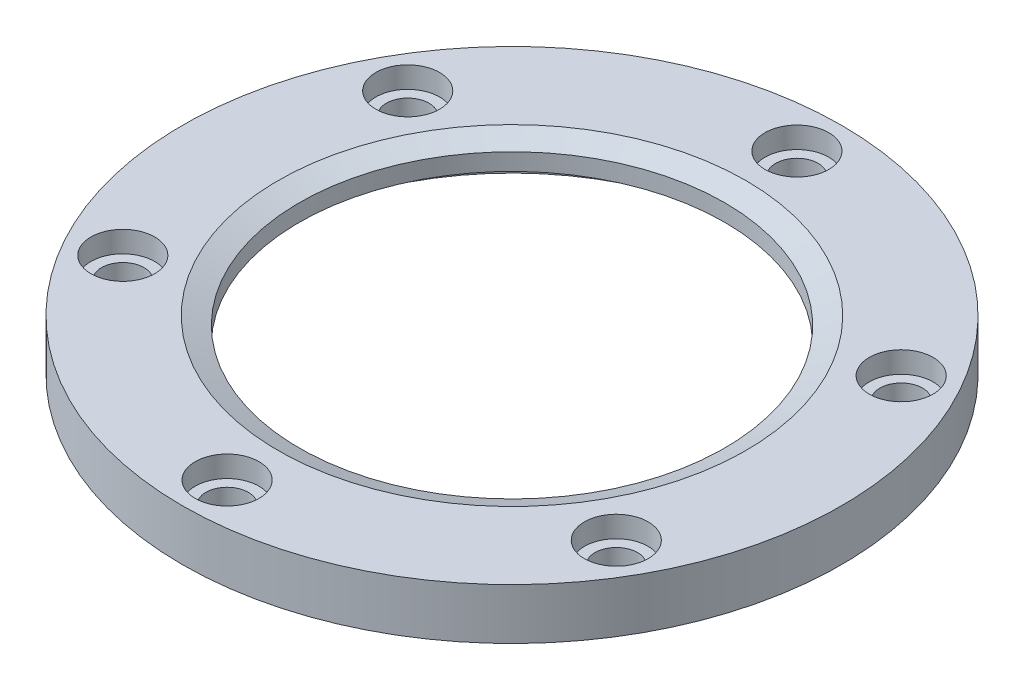
ISO-10303-21;
HEADER;
FILE_DESCRIPTION(('STEP AP214'),'2;1');
FILE_NAME('part.step','',(''),(''),'','','');
FILE_SCHEMA(('AUTOMOTIVE_DESIGN { 1 0 10303 214 1 1 1 1 }'));
ENDSEC;
DATA;
#1=APPLICATION_CONTEXT('core data for automotive mechanical design processes');
#2=APPLICATION_PROTOCOL_DEFINITION('international standard','automotive_design',2000,#1);
#3=PRODUCT_CONTEXT('',#1,'mechanical');
#4=PRODUCT('Part','Part','',(#3));
#5=PRODUCT_RELATED_PRODUCT_CATEGORY('part','',(#4));
#6=PRODUCT_DEFINITION_FORMATION('','',#4);
#7=PRODUCT_DEFINITION_CONTEXT('part definition',#1,'design');
#8=PRODUCT_DEFINITION('design','',#6,#7);
#9=PRODUCT_DEFINITION_SHAPE('','',#8);
#10=(LENGTH_UNIT() NAMED_UNIT(*) SI_UNIT(.MILLI.,.METRE.));
#11=(NAMED_UNIT(*) PLANE_ANGLE_UNIT() SI_UNIT($,.RADIAN.));
#12=(NAMED_UNIT(*) SI_UNIT($,.STERADIAN.) SOLID_ANGLE_UNIT());
#13=UNCERTAINTY_MEASURE_WITH_UNIT(LENGTH_MEASURE(1.E-05),#10,'distance_accuracy_value','');
#14=(GEOMETRIC_REPRESENTATION_CONTEXT(3) GLOBAL_UNCERTAINTY_ASSIGNED_CONTEXT((#13)) GLOBAL_UNIT_ASSIGNED_CONTEXT((#10,
#11,#12)) REPRESENTATION_CONTEXT('',''));
#15=CARTESIAN_POINT('',(0.,0.,0.));
#16=DIRECTION('',(0.,0.,1.));
#17=DIRECTION('',(1.,0.,0.));
#18=AXIS2_PLACEMENT_3D('',#15,#16,#17);
#19=CARTESIAN_POINT('',(0.,0.,0.));
#20=DIRECTION('',(0.,-1.,0.));
#21=DIRECTION('',(0.,0.,-1.));
#22=AXIS2_PLACEMENT_3D('',#19,#20,#21);
#23=CYLINDRICAL_SURFACE('',#22,50.);
#24=CARTESIAN_POINT('',(0.,10.,0.));
#25=DIRECTION('',(0.,-1.,0.));
#26=DIRECTION('',(0.,0.,-1.));
#27=AXIS2_PLACEMENT_3D('',#24,#25,#26);
#28=CIRCLE('',#27,50.);
#29=CARTESIAN_POINT('',(0.,10.,-50.));
#30=VERTEX_POINT('',#29);
#31=EDGE_CURVE('E52',#30,#30,#28,.T.);
#32=ORIENTED_EDGE('',*,*,#31,.F.);
#33=EDGE_LOOP('',(#32));
#34=FACE_BOUND('',#33,.T.);
#35=CARTESIAN_POINT('',(0.,6.,0.));
#36=DIRECTION('',(0.,-1.,0.));
#37=DIRECTION('',(0.,0.,-1.));
#38=AXIS2_PLACEMENT_3D('',#35,#36,#37);
#39=CIRCLE('',#38,50.);
#40=CARTESIAN_POINT('',(0.,6.,-50.));
#41=VERTEX_POINT('',#40);
#42=EDGE_CURVE('E39',#41,#41,#39,.F.);
#43=ORIENTED_EDGE('',*,*,#42,.F.);
#44=EDGE_LOOP('',(#43));
#45=FACE_BOUND('',#44,.T.);
#46=ADVANCED_FACE('F35',(#34,#45),#23,.F.);
#47=CARTESIAN_POINT('',(0.,12.,0.));
#48=DIRECTION('',(0.,-1.,0.));
#49=DIRECTION('',(0.,0.,-1.));
#50=AXIS2_PLACEMENT_3D('',#47,#48,#49);
#51=CYLINDRICAL_SURFACE('',#50,77.5);
#52=CARTESIAN_POINT('',(0.,12.,0.));
#53=DIRECTION('',(0.,1.,0.));
#54=DIRECTION('',(0.,0.,1.));
#55=AXIS2_PLACEMENT_3D('',#52,#53,#54);
#56=CIRCLE('',#55,77.5);
#57=CARTESIAN_POINT('',(0.,12.,77.5));
#58=VERTEX_POINT('',#57);
#59=EDGE_CURVE('E10',#58,#58,#56,.T.);
#60=ORIENTED_EDGE('',*,*,#59,.F.);
#61=EDGE_LOOP('',(#60));
#62=FACE_BOUND('',#61,.T.);
#63=CARTESIAN_POINT('',(0.,0.,0.));
#64=DIRECTION('',(0.,1.,0.));
#65=DIRECTION('',(0.,0.,1.));
#66=AXIS2_PLACEMENT_3D('',#63,#64,#65);
#67=CIRCLE('',#66,77.5);
#68=CARTESIAN_POINT('',(0.,0.,77.5));
#69=VERTEX_POINT('',#68);
#70=EDGE_CURVE('E43',#69,#69,#67,.T.);
#71=ORIENTED_EDGE('',*,*,#70,.T.);
#72=EDGE_LOOP('',(#71));
#73=FACE_BOUND('',#72,.T.);
#74=ADVANCED_FACE('F37',(#62,#73),#51,.T.);
#75=CARTESIAN_POINT('',(0.,12.,0.));
#76=DIRECTION('',(0.,1.,0.));
#77=DIRECTION('',(0.,0.,1.));
#78=AXIS2_PLACEMENT_3D('',#75,#76,#77);
#79=PLANE('',#78);
#80=CARTESIAN_POINT('',(-58.023702053557,12.,-33.5000000000007));
#81=DIRECTION('',(0.,1.,0.));
#82=DIRECTION('',(0.,0.,1.));
#83=AXIS2_PLACEMENT_3D('',#80,#81,#82);
#84=CIRCLE('',#83,7.5);
#85=CARTESIAN_POINT('',(-58.023702053557,12.,-26.0000000000007));
#86=VERTEX_POINT('',#85);
#87=EDGE_CURVE('E130',#86,#86,#84,.T.);
#88=ORIENTED_EDGE('',*,*,#87,.F.);
#89=EDGE_LOOP('',(#88));
#90=FACE_BOUND('',#89,.T.);
#91=CARTESIAN_POINT('',(-58.0237020535577,12.,33.4999999999995));
#92=DIRECTION('',(0.,1.,0.));
#93=DIRECTION('',(0.,0.,1.));
#94=AXIS2_PLACEMENT_3D('',#91,#92,#93);
#95=CIRCLE('',#94,7.5);
#96=CARTESIAN_POINT('',(-58.0237020535577,12.,40.9999999999995));
#97=VERTEX_POINT('',#96);
#98=EDGE_CURVE('E118',#97,#97,#95,.T.);
#99=ORIENTED_EDGE('',*,*,#98,.F.);
#100=EDGE_LOOP('',(#99));
#101=FACE_BOUND('',#100,.T.);
#102=CARTESIAN_POINT('',(0.,12.,67.));
#103=DIRECTION('',(0.,1.,0.));
#104=DIRECTION('',(0.,0.,1.));
#105=AXIS2_PLACEMENT_3D('',#102,#103,#104);
#106=CIRCLE('',#105,7.5);
#107=CARTESIAN_POINT('',(0.,12.,74.5));
#108=VERTEX_POINT('',#107);
#109=EDGE_CURVE('E106',#108,#108,#106,.T.);
#110=ORIENTED_EDGE('',*,*,#109,.F.);
#111=EDGE_LOOP('',(#110));
#112=FACE_BOUND('',#111,.T.);
#113=CARTESIAN_POINT('',(58.0237020535572,12.,33.5000000000003));
#114=DIRECTION('',(0.,1.,0.));
#115=DIRECTION('',(0.,0.,1.));
#116=AXIS2_PLACEMENT_3D('',#113,#114,#115);
#117=CIRCLE('',#116,7.5);
#118=CARTESIAN_POINT('',(58.0237020535572,12.,41.0000000000003));
#119=VERTEX_POINT('',#118);
#120=EDGE_CURVE('E94',#119,#119,#117,.T.);
#121=ORIENTED_EDGE('',*,*,#120,.F.);
#122=EDGE_LOOP('',(#121));
#123=FACE_BOUND('',#122,.T.);
#124=CARTESIAN_POINT('',(58.0237020535575,12.,-33.4999999999999));
#125=DIRECTION('',(0.,1.,0.));
#126=DIRECTION('',(0.,0.,1.));
#127=AXIS2_PLACEMENT_3D('',#124,#125,#126);
#128=CIRCLE('',#127,7.50000000000001);
#129=CARTESIAN_POINT('',(58.0237020535575,12.,-25.9999999999999));
#130=VERTEX_POINT('',#129);
#131=EDGE_CURVE('E82',#130,#130,#128,.T.);
#132=ORIENTED_EDGE('',*,*,#131,.F.);
#133=EDGE_LOOP('',(#132));
#134=FACE_BOUND('',#133,.T.);
#135=CARTESIAN_POINT('',(0.,12.,-67.));
#136=DIRECTION('',(0.,1.,0.));
#137=DIRECTION('',(0.,0.,1.));
#138=AXIS2_PLACEMENT_3D('',#135,#136,#137);
#139=CIRCLE('',#138,7.5);
#140=CARTESIAN_POINT('',(0.,12.,-59.5));
#141=VERTEX_POINT('',#140);
#142=EDGE_CURVE('E70',#141,#141,#139,.T.);
#143=ORIENTED_EDGE('',*,*,#142,.F.);
#144=EDGE_LOOP('',(#143));
#145=FACE_BOUND('',#144,.T.);
#146=CARTESIAN_POINT('',(0.,12.,0.));
#147=DIRECTION('',(0.,-1.,0.));
#148=DIRECTION('',(0.,0.,-1.));
#149=AXIS2_PLACEMENT_3D('',#146,#147,#148);
#150=CIRCLE('',#149,55.);
#151=CARTESIAN_POINT('',(0.,12.,-55.));
#152=VERTEX_POINT('',#151);
#153=EDGE_CURVE('E48',#152,#152,#150,.T.);
#154=ORIENTED_EDGE('',*,*,#153,.T.);
#155=EDGE_LOOP('',(#154));
#156=FACE_BOUND('',#155,.T.);
#157=ORIENTED_EDGE('',*,*,#59,.T.);
#158=EDGE_LOOP('',(#157));
#159=FACE_BOUND('',#158,.T.);
#160=ADVANCED_FACE('F136',(#90,#101,#112,#123,#134,#145,#156,#159),#79,.T.);
#161=CARTESIAN_POINT('',(0.,0.,0.));
#162=DIRECTION('',(0.,1.,0.));
#163=DIRECTION('',(0.,0.,1.));
#164=AXIS2_PLACEMENT_3D('',#161,#162,#163);
#165=PLANE('',#164);
#166=CARTESIAN_POINT('',(-58.023702053557,0.,-33.5000000000007));
#167=DIRECTION('',(0.,1.,0.));
#168=DIRECTION('',(0.,0.,1.));
#169=AXIS2_PLACEMENT_3D('',#166,#167,#168);
#170=CIRCLE('',#169,5.);
#171=CARTESIAN_POINT('',(-58.023702053557,0.,-28.5000000000007));
#172=VERTEX_POINT('',#171);
#173=EDGE_CURVE('E121',#172,#172,#170,.T.);
#174=ORIENTED_EDGE('',*,*,#173,.T.);
#175=EDGE_LOOP('',(#174));
#176=FACE_BOUND('',#175,.T.);
#177=CARTESIAN_POINT('',(-58.0237020535577,0.,33.4999999999995));
#178=DIRECTION('',(0.,1.,0.));
#179=DIRECTION('',(0.,0.,1.));
#180=AXIS2_PLACEMENT_3D('',#177,#178,#179);
#181=CIRCLE('',#180,5.);
#182=CARTESIAN_POINT('',(-58.0237020535577,0.,38.4999999999995));
#183=VERTEX_POINT('',#182);
#184=EDGE_CURVE('E109',#183,#183,#181,.T.);
#185=ORIENTED_EDGE('',*,*,#184,.T.);
#186=EDGE_LOOP('',(#185));
#187=FACE_BOUND('',#186,.T.);
#188=CARTESIAN_POINT('',(0.,0.,67.));
#189=DIRECTION('',(0.,1.,0.));
#190=DIRECTION('',(0.,0.,1.));
#191=AXIS2_PLACEMENT_3D('',#188,#189,#190);
#192=CIRCLE('',#191,5.);
#193=CARTESIAN_POINT('',(0.,0.,72.));
#194=VERTEX_POINT('',#193);
#195=EDGE_CURVE('E97',#194,#194,#192,.T.);
#196=ORIENTED_EDGE('',*,*,#195,.T.);
#197=EDGE_LOOP('',(#196));
#198=FACE_BOUND('',#197,.T.);
#199=CARTESIAN_POINT('',(58.0237020535572,0.,33.5000000000003));
#200=DIRECTION('',(0.,1.,0.));
#201=DIRECTION('',(0.,0.,1.));
#202=AXIS2_PLACEMENT_3D('',#199,#200,#201);
#203=CIRCLE('',#202,5.);
#204=CARTESIAN_POINT('',(58.0237020535572,0.,38.5000000000003));
#205=VERTEX_POINT('',#204);
#206=EDGE_CURVE('E85',#205,#205,#203,.T.);
#207=ORIENTED_EDGE('',*,*,#206,.T.);
#208=EDGE_LOOP('',(#207));
#209=FACE_BOUND('',#208,.T.);
#210=CARTESIAN_POINT('',(58.0237020535575,0.,-33.4999999999999));
#211=DIRECTION('',(0.,1.,0.));
#212=DIRECTION('',(0.,0.,1.));
#213=AXIS2_PLACEMENT_3D('',#210,#211,#212);
#214=CIRCLE('',#213,5.);
#215=CARTESIAN_POINT('',(58.0237020535575,0.,-28.4999999999999));
#216=VERTEX_POINT('',#215);
#217=EDGE_CURVE('E73',#216,#216,#214,.T.);
#218=ORIENTED_EDGE('',*,*,#217,.T.);
#219=EDGE_LOOP('',(#218));
#220=FACE_BOUND('',#219,.T.);
#221=CARTESIAN_POINT('',(0.,0.,-67.));
#222=DIRECTION('',(0.,1.,0.));
#223=DIRECTION('',(0.,0.,1.));
#224=AXIS2_PLACEMENT_3D('',#221,#222,#223);
#225=CIRCLE('',#224,5.);
#226=CARTESIAN_POINT('',(0.,0.,-62.));
#227=VERTEX_POINT('',#226);
#228=EDGE_CURVE('E59',#227,#227,#225,.T.);
#229=ORIENTED_EDGE('',*,*,#228,.T.);
#230=EDGE_LOOP('',(#229));
#231=FACE_BOUND('',#230,.T.);
#232=CARTESIAN_POINT('',(0.,0.,0.));
#233=DIRECTION('',(0.,-1.,0.));
#234=DIRECTION('',(0.,0.,-1.));
#235=AXIS2_PLACEMENT_3D('',#232,#233,#234);
#236=CIRCLE('',#235,58.);
#237=CARTESIAN_POINT('',(0.,0.,-58.));
#238=VERTEX_POINT('',#237);
#239=EDGE_CURVE('E55',#238,#238,#236,.T.);
#240=ORIENTED_EDGE('',*,*,#239,.F.);
#241=EDGE_LOOP('',(#240));
#242=FACE_BOUND('',#241,.T.);
#243=ORIENTED_EDGE('',*,*,#70,.F.);
#244=EDGE_LOOP('',(#243));
#245=FACE_BOUND('',#244,.T.);
#246=ADVANCED_FACE('F139',(#176,#187,#198,#209,#220,#231,#242,#245),#165,.F.);
#247=CARTESIAN_POINT('',(0.,10.,0.));
#248=DIRECTION('',(0.,1.,0.));
#249=DIRECTION('',(0.,0.,1.));
#250=AXIS2_PLACEMENT_3D('',#247,#248,#249);
#251=CONICAL_SURFACE('',#250,50.,1.19028994968253);
#252=ORIENTED_EDGE('',*,*,#153,.F.);
#253=EDGE_LOOP('',(#252));
#254=FACE_BOUND('',#253,.T.);
#255=ORIENTED_EDGE('',*,*,#31,.T.);
#256=EDGE_LOOP('',(#255));
#257=FACE_BOUND('',#256,.T.);
#258=ADVANCED_FACE('F153',(#254,#257),#251,.F.);
#259=CARTESIAN_POINT('',(0.,6.,0.));
#260=DIRECTION('',(0.,-1.,0.));
#261=DIRECTION('',(0.,0.,-1.));
#262=AXIS2_PLACEMENT_3D('',#259,#260,#261);
#263=PLANE('',#262);
#264=CARTESIAN_POINT('',(0.,6.,0.));
#265=DIRECTION('',(0.,-1.,0.));
#266=DIRECTION('',(0.,0.,-1.));
#267=AXIS2_PLACEMENT_3D('',#264,#265,#266);
#268=CIRCLE('',#267,58.);
#269=CARTESIAN_POINT('',(0.,6.,-58.));
#270=VERTEX_POINT('',#269);
#271=EDGE_CURVE('E58',#270,#270,#268,.T.);
#272=ORIENTED_EDGE('',*,*,#271,.T.);
#273=EDGE_LOOP('',(#272));
#274=FACE_BOUND('',#273,.T.);
#275=ORIENTED_EDGE('',*,*,#42,.T.);
#276=EDGE_LOOP('',(#275));
#277=FACE_BOUND('',#276,.T.);
#278=ADVANCED_FACE('F156',(#274,#277),#263,.T.);
#279=CARTESIAN_POINT('',(0.,6.,0.));
#280=DIRECTION('',(0.,-1.,0.));
#281=DIRECTION('',(0.,0.,-1.));
#282=AXIS2_PLACEMENT_3D('',#279,#280,#281);
#283=CYLINDRICAL_SURFACE('',#282,58.);
#284=ORIENTED_EDGE('',*,*,#271,.F.);
#285=EDGE_LOOP('',(#284));
#286=FACE_BOUND('',#285,.T.);
#287=ORIENTED_EDGE('',*,*,#239,.T.);
#288=EDGE_LOOP('',(#287));
#289=FACE_BOUND('',#288,.T.);
#290=ADVANCED_FACE('F167',(#286,#289),#283,.F.);
#291=CARTESIAN_POINT('',(0.,12.,-67.));
#292=DIRECTION('',(0.,1.,0.));
#293=DIRECTION('',(0.,0.,1.));
#294=AXIS2_PLACEMENT_3D('',#291,#292,#293);
#295=CYLINDRICAL_SURFACE('',#294,5.);
#296=ORIENTED_EDGE('',*,*,#228,.F.);
#297=EDGE_LOOP('',(#296));
#298=FACE_BOUND('',#297,.T.);
#299=CARTESIAN_POINT('',(0.,7.,-67.));
#300=DIRECTION('',(0.,1.,0.));
#301=DIRECTION('',(0.,0.,1.));
#302=AXIS2_PLACEMENT_3D('',#299,#300,#301);
#303=CIRCLE('',#302,5.);
#304=CARTESIAN_POINT('',(0.,7.,-62.));
#305=VERTEX_POINT('',#304);
#306=EDGE_CURVE('E64',#305,#305,#303,.T.);
#307=ORIENTED_EDGE('',*,*,#306,.T.);
#308=EDGE_LOOP('',(#307));
#309=FACE_BOUND('',#308,.T.);
#310=ADVANCED_FACE('F173',(#298,#309),#295,.F.);
#311=CARTESIAN_POINT('',(5.,7.,-67.));
#312=DIRECTION('',(0.,-1.,0.));
#313=DIRECTION('',(0.,0.,-1.));
#314=AXIS2_PLACEMENT_3D('',#311,#312,#313);
#315=PLANE('',#314);
#316=ORIENTED_EDGE('',*,*,#306,.F.);
#317=EDGE_LOOP('',(#316));
#318=FACE_BOUND('',#317,.T.);
#319=CARTESIAN_POINT('',(0.,7.,-67.));
#320=DIRECTION('',(0.,1.,0.));
#321=DIRECTION('',(0.,0.,1.));
#322=AXIS2_PLACEMENT_3D('',#319,#320,#321);
#323=CIRCLE('',#322,7.5);
#324=CARTESIAN_POINT('',(0.,7.,-59.5));
#325=VERTEX_POINT('',#324);
#326=EDGE_CURVE('E67',#325,#325,#323,.T.);
#327=ORIENTED_EDGE('',*,*,#326,.T.);
#328=EDGE_LOOP('',(#327));
#329=FACE_BOUND('',#328,.T.);
#330=ADVANCED_FACE('F375',(#318,#329),#315,.F.);
#331=CARTESIAN_POINT('',(0.,12.,-67.));
#332=DIRECTION('',(0.,1.,0.));
#333=DIRECTION('',(0.,0.,1.));
#334=AXIS2_PLACEMENT_3D('',#331,#332,#333);
#335=CYLINDRICAL_SURFACE('',#334,7.5);
#336=ORIENTED_EDGE('',*,*,#326,.F.);
#337=EDGE_LOOP('',(#336));
#338=FACE_BOUND('',#337,.T.);
#339=ORIENTED_EDGE('',*,*,#142,.T.);
#340=EDGE_LOOP('',(#339));
#341=FACE_BOUND('',#340,.T.);
#342=ADVANCED_FACE('F215',(#338,#341),#335,.F.);
#343=CARTESIAN_POINT('',(58.0237020535575,12.,-33.4999999999999));
#344=DIRECTION('',(0.,1.,0.));
#345=DIRECTION('',(0.,0.,1.));
#346=AXIS2_PLACEMENT_3D('',#343,#344,#345);
#347=CYLINDRICAL_SURFACE('',#346,5.);
#348=ORIENTED_EDGE('',*,*,#217,.F.);
#349=EDGE_LOOP('',(#348));
#350=FACE_BOUND('',#349,.T.);
#351=CARTESIAN_POINT('',(58.0237020535575,7.,-33.4999999999999));
#352=DIRECTION('',(0.,1.,0.));
#353=DIRECTION('',(0.,0.,1.));
#354=AXIS2_PLACEMENT_3D('',#351,#352,#353);
#355=CIRCLE('',#354,5.);
#356=CARTESIAN_POINT('',(58.0237020535575,7.,-28.4999999999999));
#357=VERTEX_POINT('',#356);
#358=EDGE_CURVE('E76',#357,#357,#355,.T.);
#359=ORIENTED_EDGE('',*,*,#358,.T.);
#360=EDGE_LOOP('',(#359));
#361=FACE_BOUND('',#360,.T.);
#362=ADVANCED_FACE('F225',(#350,#361),#347,.F.);
#363=CARTESIAN_POINT('',(63.0237020535575,7.,-33.4999999999999));
#364=DIRECTION('',(0.,-1.,0.));
#365=DIRECTION('',(0.,0.,-1.));
#366=AXIS2_PLACEMENT_3D('',#363,#364,#365);
#367=PLANE('',#366);
#368=ORIENTED_EDGE('',*,*,#358,.F.);
#369=EDGE_LOOP('',(#368));
#370=FACE_BOUND('',#369,.T.);
#371=CARTESIAN_POINT('',(58.0237020535575,7.,-33.4999999999999));
#372=DIRECTION('',(0.,1.,0.));
#373=DIRECTION('',(0.,0.,1.));
#374=AXIS2_PLACEMENT_3D('',#371,#372,#373);
#375=CIRCLE('',#374,7.49999999999999);
#376=CARTESIAN_POINT('',(58.0237020535575,7.,-25.9999999999999));
#377=VERTEX_POINT('',#376);
#378=EDGE_CURVE('E79',#377,#377,#375,.T.);
#379=ORIENTED_EDGE('',*,*,#378,.T.);
#380=EDGE_LOOP('',(#379));
#381=FACE_BOUND('',#380,.T.);
#382=ADVANCED_FACE('F230',(#370,#381),#367,.F.);
#383=CARTESIAN_POINT('',(58.0237020535575,12.,-33.4999999999999));
#384=DIRECTION('',(0.,1.,0.));
#385=DIRECTION('',(0.,0.,1.));
#386=AXIS2_PLACEMENT_3D('',#383,#384,#385);
#387=CYLINDRICAL_SURFACE('',#386,7.5);
#388=ORIENTED_EDGE('',*,*,#378,.F.);
#389=EDGE_LOOP('',(#388));
#390=FACE_BOUND('',#389,.T.);
#391=ORIENTED_EDGE('',*,*,#131,.T.);
#392=EDGE_LOOP('',(#391));
#393=FACE_BOUND('',#392,.T.);
#394=ADVANCED_FACE('F240',(#390,#393),#387,.F.);
#395=CARTESIAN_POINT('',(58.0237020535572,12.,33.5000000000003));
#396=DIRECTION('',(0.,1.,0.));
#397=DIRECTION('',(0.,0.,1.));
#398=AXIS2_PLACEMENT_3D('',#395,#396,#397);
#399=CYLINDRICAL_SURFACE('',#398,5.);
#400=ORIENTED_EDGE('',*,*,#206,.F.);
#401=EDGE_LOOP('',(#400));
#402=FACE_BOUND('',#401,.T.);
#403=CARTESIAN_POINT('',(58.0237020535572,7.,33.5000000000003));
#404=DIRECTION('',(0.,1.,0.));
#405=DIRECTION('',(0.,0.,1.));
#406=AXIS2_PLACEMENT_3D('',#403,#404,#405);
#407=CIRCLE('',#406,5.);
#408=CARTESIAN_POINT('',(58.0237020535572,7.,38.5000000000003));
#409=VERTEX_POINT('',#408);
#410=EDGE_CURVE('E88',#409,#409,#407,.T.);
#411=ORIENTED_EDGE('',*,*,#410,.T.);
#412=EDGE_LOOP('',(#411));
#413=FACE_BOUND('',#412,.T.);
#414=ADVANCED_FACE('F250',(#402,#413),#399,.F.);
#415=CARTESIAN_POINT('',(63.0237020535572,7.,33.5000000000003));
#416=DIRECTION('',(0.,-1.,0.));
#417=DIRECTION('',(0.,0.,-1.));
#418=AXIS2_PLACEMENT_3D('',#415,#416,#417);
#419=PLANE('',#418);
#420=ORIENTED_EDGE('',*,*,#410,.F.);
#421=EDGE_LOOP('',(#420));
#422=FACE_BOUND('',#421,.T.);
#423=CARTESIAN_POINT('',(58.0237020535572,7.,33.5000000000003));
#424=DIRECTION('',(0.,1.,0.));
#425=DIRECTION('',(0.,0.,1.));
#426=AXIS2_PLACEMENT_3D('',#423,#424,#425);
#427=CIRCLE('',#426,7.5);
#428=CARTESIAN_POINT('',(58.0237020535572,7.,41.0000000000003));
#429=VERTEX_POINT('',#428);
#430=EDGE_CURVE('E91',#429,#429,#427,.T.);
#431=ORIENTED_EDGE('',*,*,#430,.T.);
#432=EDGE_LOOP('',(#431));
#433=FACE_BOUND('',#432,.T.);
#434=ADVANCED_FACE('F260',(#422,#433),#419,.F.);
#435=CARTESIAN_POINT('',(58.0237020535572,12.,33.5000000000003));
#436=DIRECTION('',(0.,1.,0.));
#437=DIRECTION('',(0.,0.,1.));
#438=AXIS2_PLACEMENT_3D('',#435,#436,#437);
#439=CYLINDRICAL_SURFACE('',#438,7.5);
#440=ORIENTED_EDGE('',*,*,#430,.F.);
#441=EDGE_LOOP('',(#440));
#442=FACE_BOUND('',#441,.T.);
#443=ORIENTED_EDGE('',*,*,#120,.T.);
#444=EDGE_LOOP('',(#443));
#445=FACE_BOUND('',#444,.T.);
#446=ADVANCED_FACE('F270',(#442,#445),#439,.F.);
#447=CARTESIAN_POINT('',(0.,12.,67.));
#448=DIRECTION('',(0.,1.,0.));
#449=DIRECTION('',(0.,0.,1.));
#450=AXIS2_PLACEMENT_3D('',#447,#448,#449);
#451=CYLINDRICAL_SURFACE('',#450,5.);
#452=ORIENTED_EDGE('',*,*,#195,.F.);
#453=EDGE_LOOP('',(#452));
#454=FACE_BOUND('',#453,.T.);
#455=CARTESIAN_POINT('',(0.,7.,67.));
#456=DIRECTION('',(0.,1.,0.));
#457=DIRECTION('',(0.,0.,1.));
#458=AXIS2_PLACEMENT_3D('',#455,#456,#457);
#459=CIRCLE('',#458,5.);
#460=CARTESIAN_POINT('',(0.,7.,72.));
#461=VERTEX_POINT('',#460);
#462=EDGE_CURVE('E100',#461,#461,#459,.T.);
#463=ORIENTED_EDGE('',*,*,#462,.T.);
#464=EDGE_LOOP('',(#463));
#465=FACE_BOUND('',#464,.T.);
#466=ADVANCED_FACE('F280',(#454,#465),#451,.F.);
#467=CARTESIAN_POINT('',(5.,7.,67.));
#468=DIRECTION('',(0.,-1.,0.));
#469=DIRECTION('',(0.,0.,-1.));
#470=AXIS2_PLACEMENT_3D('',#467,#468,#469);
#471=PLANE('',#470);
#472=ORIENTED_EDGE('',*,*,#462,.F.);
#473=EDGE_LOOP('',(#472));
#474=FACE_BOUND('',#473,.T.);
#475=CARTESIAN_POINT('',(0.,7.,67.));
#476=DIRECTION('',(0.,1.,0.));
#477=DIRECTION('',(0.,0.,1.));
#478=AXIS2_PLACEMENT_3D('',#475,#476,#477);
#479=CIRCLE('',#478,7.5);
#480=CARTESIAN_POINT('',(0.,7.,74.5));
#481=VERTEX_POINT('',#480);
#482=EDGE_CURVE('E103',#481,#481,#479,.T.);
#483=ORIENTED_EDGE('',*,*,#482,.T.);
#484=EDGE_LOOP('',(#483));
#485=FACE_BOUND('',#484,.T.);
#486=ADVANCED_FACE('F290',(#474,#485),#471,.F.);
#487=CARTESIAN_POINT('',(0.,12.,67.));
#488=DIRECTION('',(0.,1.,0.));
#489=DIRECTION('',(0.,0.,1.));
#490=AXIS2_PLACEMENT_3D('',#487,#488,#489);
#491=CYLINDRICAL_SURFACE('',#490,7.5);
#492=ORIENTED_EDGE('',*,*,#482,.F.);
#493=EDGE_LOOP('',(#492));
#494=FACE_BOUND('',#493,.T.);
#495=ORIENTED_EDGE('',*,*,#109,.T.);
#496=EDGE_LOOP('',(#495));
#497=FACE_BOUND('',#496,.T.);
#498=ADVANCED_FACE('F300',(#494,#497),#491,.F.);
#499=CARTESIAN_POINT('',(-58.0237020535577,12.,33.4999999999995));
#500=DIRECTION('',(0.,1.,0.));
#501=DIRECTION('',(0.,0.,1.));
#502=AXIS2_PLACEMENT_3D('',#499,#500,#501);
#503=CYLINDRICAL_SURFACE('',#502,5.);
#504=ORIENTED_EDGE('',*,*,#184,.F.);
#505=EDGE_LOOP('',(#504));
#506=FACE_BOUND('',#505,.T.);
#507=CARTESIAN_POINT('',(-58.0237020535577,7.,33.4999999999995));
#508=DIRECTION('',(0.,1.,0.));
#509=DIRECTION('',(0.,0.,1.));
#510=AXIS2_PLACEMENT_3D('',#507,#508,#509);
#511=CIRCLE('',#510,5.);
#512=CARTESIAN_POINT('',(-58.0237020535577,7.,38.4999999999995));
#513=VERTEX_POINT('',#512);
#514=EDGE_CURVE('E112',#513,#513,#511,.T.);
#515=ORIENTED_EDGE('',*,*,#514,.T.);
#516=EDGE_LOOP('',(#515));
#517=FACE_BOUND('',#516,.T.);
#518=ADVANCED_FACE('F310',(#506,#517),#503,.F.);
#519=CARTESIAN_POINT('',(-53.0237020535577,7.,33.4999999999995));
#520=DIRECTION('',(0.,-1.,0.));
#521=DIRECTION('',(0.,0.,-1.));
#522=AXIS2_PLACEMENT_3D('',#519,#520,#521);
#523=PLANE('',#522);
#524=ORIENTED_EDGE('',*,*,#514,.F.);
#525=EDGE_LOOP('',(#524));
#526=FACE_BOUND('',#525,.T.);
#527=CARTESIAN_POINT('',(-58.0237020535577,7.,33.4999999999995));
#528=DIRECTION('',(0.,1.,0.));
#529=DIRECTION('',(0.,0.,1.));
#530=AXIS2_PLACEMENT_3D('',#527,#528,#529);
#531=CIRCLE('',#530,7.5);
#532=CARTESIAN_POINT('',(-58.0237020535577,7.,40.9999999999995));
#533=VERTEX_POINT('',#532);
#534=EDGE_CURVE('E115',#533,#533,#531,.T.);
#535=ORIENTED_EDGE('',*,*,#534,.T.);
#536=EDGE_LOOP('',(#535));
#537=FACE_BOUND('',#536,.T.);
#538=ADVANCED_FACE('F320',(#526,#537),#523,.F.);
#539=CARTESIAN_POINT('',(-58.0237020535577,12.,33.4999999999995));
#540=DIRECTION('',(0.,1.,0.));
#541=DIRECTION('',(0.,0.,1.));
#542=AXIS2_PLACEMENT_3D('',#539,#540,#541);
#543=CYLINDRICAL_SURFACE('',#542,7.5);
#544=ORIENTED_EDGE('',*,*,#534,.F.);
#545=EDGE_LOOP('',(#544));
#546=FACE_BOUND('',#545,.T.);
#547=ORIENTED_EDGE('',*,*,#98,.T.);
#548=EDGE_LOOP('',(#547));
#549=FACE_BOUND('',#548,.T.);
#550=ADVANCED_FACE('F330',(#546,#549),#543,.F.);
#551=CARTESIAN_POINT('',(-58.023702053557,12.,-33.5000000000007));
#552=DIRECTION('',(0.,1.,0.));
#553=DIRECTION('',(0.,0.,1.));
#554=AXIS2_PLACEMENT_3D('',#551,#552,#553);
#555=CYLINDRICAL_SURFACE('',#554,5.);
#556=ORIENTED_EDGE('',*,*,#173,.F.);
#557=EDGE_LOOP('',(#556));
#558=FACE_BOUND('',#557,.T.);
#559=CARTESIAN_POINT('',(-58.023702053557,7.,-33.5000000000007));
#560=DIRECTION('',(0.,1.,0.));
#561=DIRECTION('',(0.,0.,1.));
#562=AXIS2_PLACEMENT_3D('',#559,#560,#561);
#563=CIRCLE('',#562,5.);
#564=CARTESIAN_POINT('',(-58.023702053557,7.,-28.5000000000007));
#565=VERTEX_POINT('',#564);
#566=EDGE_CURVE('E124',#565,#565,#563,.T.);
#567=ORIENTED_EDGE('',*,*,#566,.T.);
#568=EDGE_LOOP('',(#567));
#569=FACE_BOUND('',#568,.T.);
#570=ADVANCED_FACE('F340',(#558,#569),#555,.F.);
#571=CARTESIAN_POINT('',(-53.023702053557,7.,-33.5000000000007));
#572=DIRECTION('',(0.,-1.,0.));
#573=DIRECTION('',(0.,0.,-1.));
#574=AXIS2_PLACEMENT_3D('',#571,#572,#573);
#575=PLANE('',#574);
#576=ORIENTED_EDGE('',*,*,#566,.F.);
#577=EDGE_LOOP('',(#576));
#578=FACE_BOUND('',#577,.T.);
#579=CARTESIAN_POINT('',(-58.023702053557,7.,-33.5000000000007));
#580=DIRECTION('',(0.,1.,0.));
#581=DIRECTION('',(0.,0.,1.));
#582=AXIS2_PLACEMENT_3D('',#579,#580,#581);
#583=CIRCLE('',#582,7.5);
#584=CARTESIAN_POINT('',(-58.023702053557,7.,-26.0000000000007));
#585=VERTEX_POINT('',#584);
#586=EDGE_CURVE('E127',#585,#585,#583,.T.);
#587=ORIENTED_EDGE('',*,*,#586,.T.);
#588=EDGE_LOOP('',(#587));
#589=FACE_BOUND('',#588,.T.);
#590=ADVANCED_FACE('F350',(#578,#589),#575,.F.);
#591=CARTESIAN_POINT('',(-58.023702053557,12.,-33.5000000000007));
#592=DIRECTION('',(0.,1.,0.));
#593=DIRECTION('',(0.,0.,1.));
#594=AXIS2_PLACEMENT_3D('',#591,#592,#593);
#595=CYLINDRICAL_SURFACE('',#594,7.5);
#596=ORIENTED_EDGE('',*,*,#586,.F.);
#597=EDGE_LOOP('',(#596));
#598=FACE_BOUND('',#597,.T.);
#599=ORIENTED_EDGE('',*,*,#87,.T.);
#600=EDGE_LOOP('',(#599));
#601=FACE_BOUND('',#600,.T.);
#602=ADVANCED_FACE('F134',(#598,#601),#595,.F.);
#603=CLOSED_SHELL('',(#46,#74,#160,#246,#258,#278,#290,#310,#330,#342,#362,#382,#394,#414,#434,
#446,#466,#486,#498,#518,#538,#550,#570,#590,#602));
#604=MANIFOLD_SOLID_BREP('B2',#603);
#605=ADVANCED_BREP_SHAPE_REPRESENTATION('',(#18,#604),#14);
#606=SHAPE_DEFINITION_REPRESENTATION(#9,#605);
ENDSEC;
END-ISO-10303-21;
